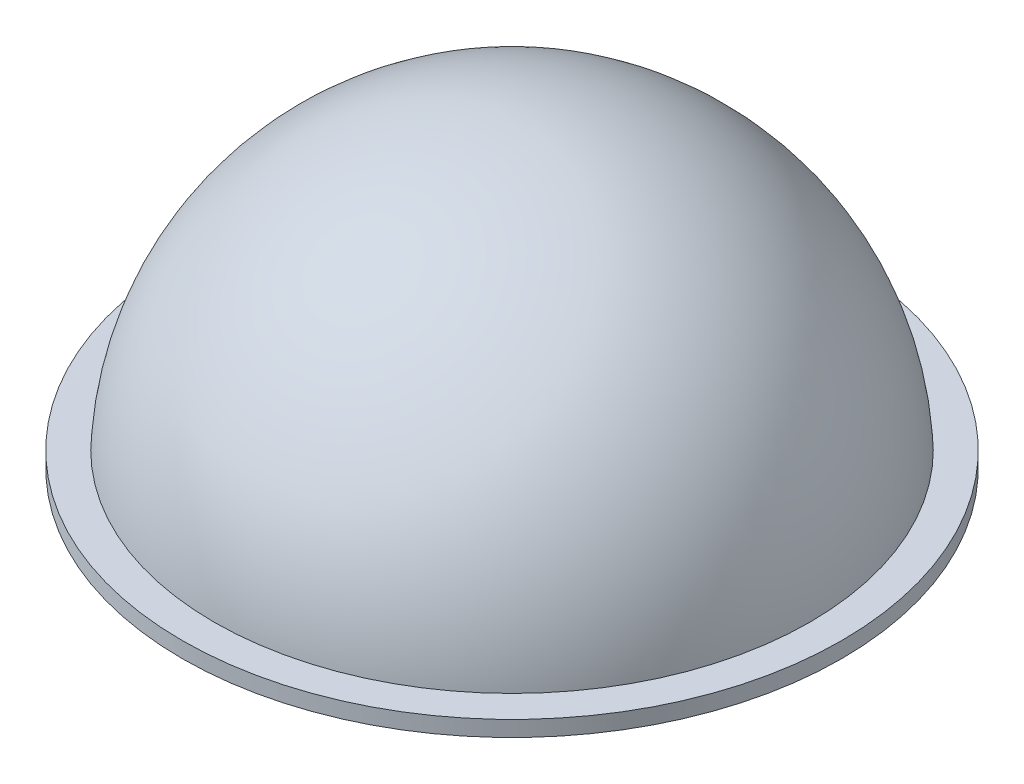
ISO-10303-21;
HEADER;
FILE_DESCRIPTION(('STEP AP214'),'2;1');
FILE_NAME('part.step','',(''),(''),'','','');
FILE_SCHEMA(('AUTOMOTIVE_DESIGN { 1 0 10303 214 1 1 1 1 }'));
ENDSEC;
DATA;
#1=APPLICATION_CONTEXT('core data for automotive mechanical design processes');
#2=APPLICATION_PROTOCOL_DEFINITION('international standard','automotive_design',2000,#1);
#3=PRODUCT_CONTEXT('',#1,'mechanical');
#4=PRODUCT('Part','Part','',(#3));
#5=PRODUCT_RELATED_PRODUCT_CATEGORY('part','',(#4));
#6=PRODUCT_DEFINITION_FORMATION('','',#4);
#7=PRODUCT_DEFINITION_CONTEXT('part definition',#1,'design');
#8=PRODUCT_DEFINITION('design','',#6,#7);
#9=PRODUCT_DEFINITION_SHAPE('','',#8);
#10=(LENGTH_UNIT() NAMED_UNIT(*) SI_UNIT(.MILLI.,.METRE.));
#11=(NAMED_UNIT(*) PLANE_ANGLE_UNIT() SI_UNIT($,.RADIAN.));
#12=(NAMED_UNIT(*) SI_UNIT($,.STERADIAN.) SOLID_ANGLE_UNIT());
#13=UNCERTAINTY_MEASURE_WITH_UNIT(LENGTH_MEASURE(1.E-05),#10,'distance_accuracy_value','');
#14=(GEOMETRIC_REPRESENTATION_CONTEXT(3) GLOBAL_UNCERTAINTY_ASSIGNED_CONTEXT((#13)) GLOBAL_UNIT_ASSIGNED_CONTEXT((#10,
#11,#12)) REPRESENTATION_CONTEXT('',''));
#15=CARTESIAN_POINT('',(0.,0.,0.));
#16=DIRECTION('',(0.,0.,1.));
#17=DIRECTION('',(1.,0.,0.));
#18=AXIS2_PLACEMENT_3D('',#15,#16,#17);
#19=CARTESIAN_POINT('',(-105.,0.,0.));
#20=DIRECTION('',(0.,1.,0.));
#21=DIRECTION('',(-1.,0.,0.));
#22=AXIS2_PLACEMENT_3D('',#19,#20,#21);
#23=PLANE('',#22);
#24=CARTESIAN_POINT('',(0.,0.,0.));
#25=DIRECTION('',(0.,-1.,0.));
#26=DIRECTION('',(1.,0.,0.));
#27=AXIS2_PLACEMENT_3D('',#24,#25,#26);
#28=CIRCLE('',#27,90.);
#29=CARTESIAN_POINT('',(90.,0.,0.));
#30=VERTEX_POINT('',#29);
#31=EDGE_CURVE('E10',#30,#30,#28,.T.);
#32=ORIENTED_EDGE('',*,*,#31,.F.);
#33=EDGE_LOOP('',(#32));
#34=FACE_BOUND('',#33,.T.);
#35=CARTESIAN_POINT('',(0.,0.,0.));
#36=DIRECTION('',(0.,-1.,0.));
#37=DIRECTION('',(1.,0.,0.));
#38=AXIS2_PLACEMENT_3D('',#35,#36,#37);
#39=CIRCLE('',#38,105.);
#40=CARTESIAN_POINT('',(105.,0.,0.));
#41=VERTEX_POINT('',#40);
#42=EDGE_CURVE('E46',#41,#41,#39,.T.);
#43=ORIENTED_EDGE('',*,*,#42,.T.);
#44=EDGE_LOOP('',(#43));
#45=FACE_BOUND('',#44,.T.);
#46=ADVANCED_FACE('F32',(#34,#45),#23,.F.);
#47=CARTESIAN_POINT('',(0.,0.,0.));
#48=DIRECTION('',(0.,-1.,0.));
#49=DIRECTION('',(-1.,0.,0.));
#50=AXIS2_PLACEMENT_3D('',#47,#48,#49);
#51=SPHERICAL_SURFACE('',#50,90.);
#52=ORIENTED_EDGE('',*,*,#31,.T.);
#53=EDGE_LOOP('',(#52));
#54=FACE_BOUND('',#53,.T.);
#55=ADVANCED_FACE('F66',(#54),#51,.F.);
#56=CARTESIAN_POINT('',(0.,0.,0.));
#57=DIRECTION('',(0.,-1.,0.));
#58=DIRECTION('',(-1.,0.,0.));
#59=AXIS2_PLACEMENT_3D('',#56,#57,#58);
#60=SPHERICAL_SURFACE('',#59,95.);
#61=CARTESIAN_POINT('',(0.,5.,0.));
#62=DIRECTION('',(0.,-1.,0.));
#63=DIRECTION('',(1.,0.,0.));
#64=AXIS2_PLACEMENT_3D('',#61,#62,#63);
#65=CIRCLE('',#64,94.8683298050514);
#66=CARTESIAN_POINT('',(94.8683298050514,5.,0.));
#67=VERTEX_POINT('',#66);
#68=EDGE_CURVE('E38',#67,#67,#65,.T.);
#69=ORIENTED_EDGE('',*,*,#68,.F.);
#70=EDGE_LOOP('',(#69));
#71=FACE_BOUND('',#70,.T.);
#72=ADVANCED_FACE('F61',(#71),#60,.T.);
#73=CARTESIAN_POINT('',(-105.,5.,0.));
#74=DIRECTION('',(0.,-1.,0.));
#75=DIRECTION('',(1.,0.,0.));
#76=AXIS2_PLACEMENT_3D('',#73,#74,#75);
#77=PLANE('',#76);
#78=CARTESIAN_POINT('',(0.,5.,0.));
#79=DIRECTION('',(0.,-1.,0.));
#80=DIRECTION('',(1.,0.,0.));
#81=AXIS2_PLACEMENT_3D('',#78,#79,#80);
#82=CIRCLE('',#81,105.);
#83=CARTESIAN_POINT('',(105.,5.,0.));
#84=VERTEX_POINT('',#83);
#85=EDGE_CURVE('E42',#84,#84,#82,.T.);
#86=ORIENTED_EDGE('',*,*,#85,.F.);
#87=EDGE_LOOP('',(#86));
#88=FACE_BOUND('',#87,.T.);
#89=ORIENTED_EDGE('',*,*,#68,.T.);
#90=EDGE_LOOP('',(#89));
#91=FACE_BOUND('',#90,.T.);
#92=ADVANCED_FACE('F56',(#88,#91),#77,.F.);
#93=CARTESIAN_POINT('',(0.,0.,0.));
#94=DIRECTION('',(0.,-1.,0.));
#95=DIRECTION('',(1.,0.,0.));
#96=AXIS2_PLACEMENT_3D('',#93,#94,#95);
#97=CYLINDRICAL_SURFACE('',#96,105.);
#98=ORIENTED_EDGE('',*,*,#42,.F.);
#99=EDGE_LOOP('',(#98));
#100=FACE_BOUND('',#99,.T.);
#101=ORIENTED_EDGE('',*,*,#85,.T.);
#102=EDGE_LOOP('',(#101));
#103=FACE_BOUND('',#102,.T.);
#104=ADVANCED_FACE('F53',(#100,#103),#97,.T.);
#105=CLOSED_SHELL('',(#46,#55,#72,#92,#104));
#106=MANIFOLD_SOLID_BREP('B2',#105);
#107=ADVANCED_BREP_SHAPE_REPRESENTATION('',(#18,#106),#14);
#108=SHAPE_DEFINITION_REPRESENTATION(#9,#107);
ENDSEC;
END-ISO-10303-21;
